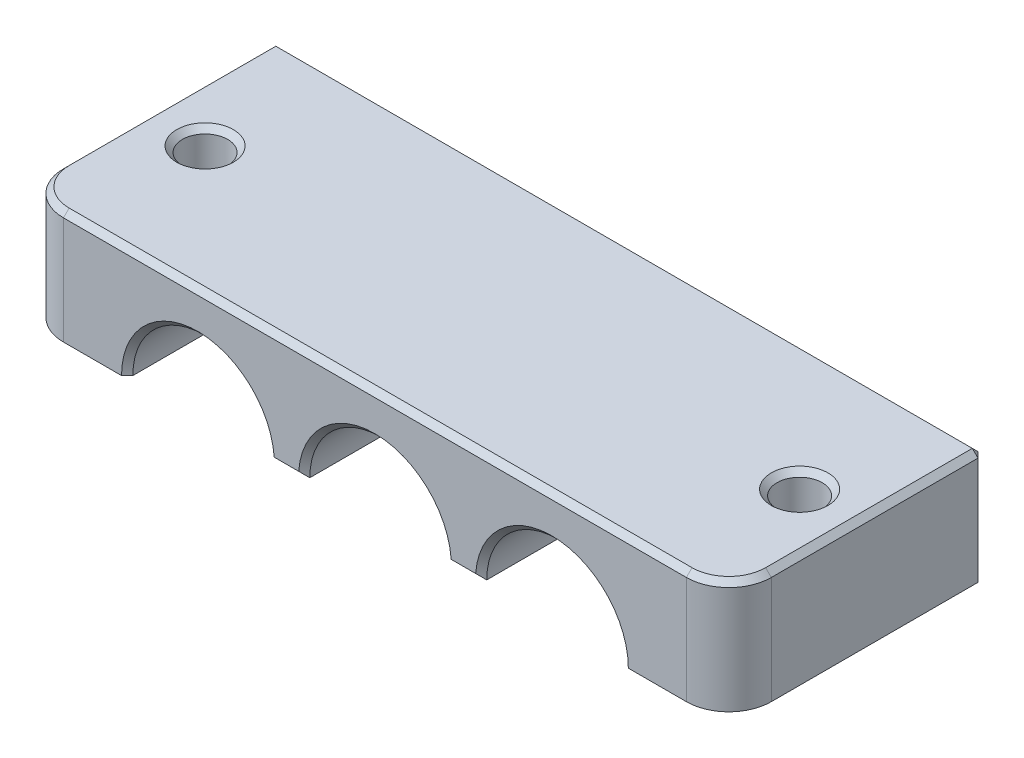
ISO-10303-21;
HEADER;
FILE_DESCRIPTION(('STEP AP214'),'2;1');
FILE_NAME('part.step','',(''),(''),'','','');
FILE_SCHEMA(('AUTOMOTIVE_DESIGN { 1 0 10303 214 1 1 1 1 }'));
ENDSEC;
DATA;
#1=APPLICATION_CONTEXT('core data for automotive mechanical design processes');
#2=APPLICATION_PROTOCOL_DEFINITION('international standard','automotive_design',2000,#1);
#3=PRODUCT_CONTEXT('',#1,'mechanical');
#4=PRODUCT('Part','Part','',(#3));
#5=PRODUCT_RELATED_PRODUCT_CATEGORY('part','',(#4));
#6=PRODUCT_DEFINITION_FORMATION('','',#4);
#7=PRODUCT_DEFINITION_CONTEXT('part definition',#1,'design');
#8=PRODUCT_DEFINITION('design','',#6,#7);
#9=PRODUCT_DEFINITION_SHAPE('','',#8);
#10=(LENGTH_UNIT() NAMED_UNIT(*) SI_UNIT(.MILLI.,.METRE.));
#11=(NAMED_UNIT(*) PLANE_ANGLE_UNIT() SI_UNIT($,.RADIAN.));
#12=(NAMED_UNIT(*) SI_UNIT($,.STERADIAN.) SOLID_ANGLE_UNIT());
#13=UNCERTAINTY_MEASURE_WITH_UNIT(LENGTH_MEASURE(1.E-05),#10,'distance_accuracy_value','');
#14=(GEOMETRIC_REPRESENTATION_CONTEXT(3) GLOBAL_UNCERTAINTY_ASSIGNED_CONTEXT((#13)) GLOBAL_UNIT_ASSIGNED_CONTEXT((#10,
#11,#12)) REPRESENTATION_CONTEXT('',''));
#15=CARTESIAN_POINT('',(0.,0.,0.));
#16=DIRECTION('',(0.,0.,1.));
#17=DIRECTION('',(1.,0.,0.));
#18=AXIS2_PLACEMENT_3D('',#15,#16,#17);
#19=CARTESIAN_POINT('',(0.,0.,18.));
#20=DIRECTION('',(0.,0.,-1.));
#21=DIRECTION('',(-1.,0.,0.));
#22=AXIS2_PLACEMENT_3D('',#19,#20,#21);
#23=CYLINDRICAL_SURFACE('',#22,5.);
#24=DIRECTION('',(0.,0.,-1.));
#25=VECTOR('',#24,1.);
#26=CARTESIAN_POINT('',(-5.,0.,18.));
#27=LINE('',#26,#25);
#28=CARTESIAN_POINT('',(-5.,0.,17.6));
#29=VERTEX_POINT('',#28);
#30=CARTESIAN_POINT('',(-5.,0.,0.400000000000011));
#31=VERTEX_POINT('',#30);
#32=EDGE_CURVE('E576',#29,#31,#27,.T.);
#33=ORIENTED_EDGE('',*,*,#32,.T.);
#34=CARTESIAN_POINT('',(0.,0.,0.400000000000011));
#35=DIRECTION('',(0.,0.,-1.));
#36=DIRECTION('',(-1.,0.,0.));
#37=AXIS2_PLACEMENT_3D('',#34,#35,#36);
#38=CIRCLE('',#37,5.);
#39=CARTESIAN_POINT('',(5.,0.,0.400000000000011));
#40=VERTEX_POINT('',#39);
#41=EDGE_CURVE('E297',#31,#40,#38,.T.);
#42=ORIENTED_EDGE('',*,*,#41,.T.);
#43=DIRECTION('',(0.,0.,-1.));
#44=VECTOR('',#43,1.);
#45=CARTESIAN_POINT('',(5.,0.,18.));
#46=LINE('',#45,#44);
#47=CARTESIAN_POINT('',(5.,0.,17.6));
#48=VERTEX_POINT('',#47);
#49=EDGE_CURVE('E225',#48,#40,#46,.T.);
#50=ORIENTED_EDGE('',*,*,#49,.F.);
#51=CARTESIAN_POINT('',(0.,0.,17.6));
#52=DIRECTION('',(0.,0.,-1.));
#53=DIRECTION('',(-1.,0.,0.));
#54=AXIS2_PLACEMENT_3D('',#51,#52,#53);
#55=CIRCLE('',#54,5.);
#56=EDGE_CURVE('E295',#48,#29,#55,.F.);
#57=ORIENTED_EDGE('',*,*,#56,.T.);
#58=EDGE_LOOP('',(#33,#42,#50,#57));
#59=FACE_BOUND('',#58,.T.);
#60=ADVANCED_FACE('F39',(#59),#23,.F.);
#61=CARTESIAN_POINT('',(5.,0.,18.));
#62=DIRECTION('',(0.,1.,0.));
#63=DIRECTION('',(-1.,0.,0.));
#64=AXIS2_PLACEMENT_3D('',#61,#62,#63);
#65=PLANE('',#64);
#66=ORIENTED_EDGE('',*,*,#49,.T.);
#67=DIRECTION('',(1.,0.,0.));
#68=VECTOR('',#67,1.);
#69=CARTESIAN_POINT('',(7.5,0.,0.400000000000011));
#70=LINE('',#69,#68);
#71=CARTESIAN_POINT('',(7.5,0.,0.400000000000011));
#72=VERTEX_POINT('',#71);
#73=EDGE_CURVE('E293',#40,#72,#70,.T.);
#74=ORIENTED_EDGE('',*,*,#73,.T.);
#75=DIRECTION('',(0.,0.,-1.));
#76=VECTOR('',#75,1.);
#77=CARTESIAN_POINT('',(7.5,0.,18.));
#78=LINE('',#77,#76);
#79=CARTESIAN_POINT('',(7.5,0.,17.6));
#80=VERTEX_POINT('',#79);
#81=EDGE_CURVE('E230',#80,#72,#78,.T.);
#82=ORIENTED_EDGE('',*,*,#81,.F.);
#83=DIRECTION('',(-1.,0.,0.));
#84=VECTOR('',#83,1.);
#85=CARTESIAN_POINT('',(5.,0.,17.6));
#86=LINE('',#85,#84);
#87=EDGE_CURVE('E291',#80,#48,#86,.T.);
#88=ORIENTED_EDGE('',*,*,#87,.T.);
#89=EDGE_LOOP('',(#66,#74,#82,#88));
#90=FACE_BOUND('',#89,.T.);
#91=ADVANCED_FACE('F524',(#90),#65,.F.);
#92=CARTESIAN_POINT('',(12.5,0.,18.));
#93=DIRECTION('',(0.,0.,-1.));
#94=DIRECTION('',(-1.,0.,0.));
#95=AXIS2_PLACEMENT_3D('',#92,#93,#94);
#96=CYLINDRICAL_SURFACE('',#95,5.);
#97=ORIENTED_EDGE('',*,*,#81,.T.);
#98=CARTESIAN_POINT('',(12.5,0.,0.400000000000011));
#99=DIRECTION('',(0.,0.,-1.));
#100=DIRECTION('',(-1.,0.,0.));
#101=AXIS2_PLACEMENT_3D('',#98,#99,#100);
#102=CIRCLE('',#101,5.);
#103=CARTESIAN_POINT('',(17.5,0.,0.400000000000011));
#104=VERTEX_POINT('',#103);
#105=EDGE_CURVE('E265',#72,#104,#102,.T.);
#106=ORIENTED_EDGE('',*,*,#105,.T.);
#107=DIRECTION('',(0.,0.,-1.));
#108=VECTOR('',#107,1.);
#109=CARTESIAN_POINT('',(17.5,0.,18.));
#110=LINE('',#109,#108);
#111=CARTESIAN_POINT('',(17.5,0.,17.6));
#112=VERTEX_POINT('',#111);
#113=EDGE_CURVE('E591',#112,#104,#110,.T.);
#114=ORIENTED_EDGE('',*,*,#113,.F.);
#115=CARTESIAN_POINT('',(12.5,0.,17.6));
#116=DIRECTION('',(0.,0.,-1.));
#117=DIRECTION('',(-1.,0.,0.));
#118=AXIS2_PLACEMENT_3D('',#115,#116,#117);
#119=CIRCLE('',#118,5.);
#120=EDGE_CURVE('E263',#112,#80,#119,.F.);
#121=ORIENTED_EDGE('',*,*,#120,.T.);
#122=EDGE_LOOP('',(#97,#106,#114,#121));
#123=FACE_BOUND('',#122,.T.);
#124=ADVANCED_FACE('F530',(#123),#96,.F.);
#125=CARTESIAN_POINT('',(17.5,0.,18.));
#126=DIRECTION('',(0.,1.,0.));
#127=DIRECTION('',(-1.,0.,0.));
#128=AXIS2_PLACEMENT_3D('',#125,#126,#127);
#129=PLANE('',#128);
#130=CARTESIAN_POINT('',(21.,0.,8.99999999999999));
#131=DIRECTION('',(0.,1.,0.));
#132=DIRECTION('',(0.,0.,1.));
#133=AXIS2_PLACEMENT_3D('',#130,#131,#132);
#134=CIRCLE('',#133,1.6);
#135=CARTESIAN_POINT('',(21.,0.,10.6));
#136=VERTEX_POINT('',#135);
#137=EDGE_CURVE('E388',#136,#136,#134,.T.);
#138=ORIENTED_EDGE('',*,*,#137,.T.);
#139=EDGE_LOOP('',(#138));
#140=FACE_BOUND('',#139,.T.);
#141=ORIENTED_EDGE('',*,*,#113,.T.);
#142=DIRECTION('',(0.707106781186551,0.,-0.707106781186544));
#143=VECTOR('',#142,1.);
#144=CARTESIAN_POINT('',(12.5,0.,5.39999999999997));
#145=LINE('',#144,#143);
#146=CARTESIAN_POINT('',(17.9,0.,0.));
#147=VERTEX_POINT('',#146);
#148=EDGE_CURVE('E272',#104,#147,#145,.T.);
#149=ORIENTED_EDGE('',*,*,#148,.T.);
#150=DIRECTION('',(1.,0.,0.));
#151=VECTOR('',#150,1.);
#152=CARTESIAN_POINT('',(17.5,0.,0.));
#153=LINE('',#152,#151);
#154=CARTESIAN_POINT('',(24.6,0.,0.));
#155=VERTEX_POINT('',#154);
#156=EDGE_CURVE('E568',#147,#155,#153,.T.);
#157=ORIENTED_EDGE('',*,*,#156,.T.);
#158=DIRECTION('',(0.707106781186548,0.,0.707106781186548));
#159=VECTOR('',#158,1.);
#160=CARTESIAN_POINT('',(25.,0.,0.399999999999998));
#161=LINE('',#160,#159);
#162=CARTESIAN_POINT('',(25.,0.,0.399999999999998));
#163=VERTEX_POINT('',#162);
#164=EDGE_CURVE('E270',#155,#163,#161,.T.);
#165=ORIENTED_EDGE('',*,*,#164,.T.);
#166=DIRECTION('',(0.,0.,-1.));
#167=VECTOR('',#166,1.);
#168=CARTESIAN_POINT('',(25.,0.,18.));
#169=LINE('',#168,#167);
#170=CARTESIAN_POINT('',(25.,0.,15.));
#171=VERTEX_POINT('',#170);
#172=EDGE_CURVE('E216',#171,#163,#169,.T.);
#173=ORIENTED_EDGE('',*,*,#172,.F.);
#174=CARTESIAN_POINT('',(22.,0.,15.));
#175=DIRECTION('',(0.,1.,0.));
#176=DIRECTION('',(-1.,0.,0.));
#177=AXIS2_PLACEMENT_3D('',#174,#175,#176);
#178=CIRCLE('',#177,3.);
#179=CARTESIAN_POINT('',(22.,0.,18.));
#180=VERTEX_POINT('',#179);
#181=EDGE_CURVE('E213',#171,#180,#178,.F.);
#182=ORIENTED_EDGE('',*,*,#181,.T.);
#183=DIRECTION('',(1.,0.,0.));
#184=VECTOR('',#183,1.);
#185=CARTESIAN_POINT('',(17.5,0.,18.));
#186=LINE('',#185,#184);
#187=CARTESIAN_POINT('',(17.9,0.,18.));
#188=VERTEX_POINT('',#187);
#189=EDGE_CURVE('E199',#188,#180,#186,.T.);
#190=ORIENTED_EDGE('',*,*,#189,.F.);
#191=DIRECTION('',(-0.707106781186547,0.,-0.707106781186548));
#192=VECTOR('',#191,1.);
#193=CARTESIAN_POINT('',(12.5,0.,12.6));
#194=LINE('',#193,#192);
#195=EDGE_CURVE('E268',#188,#112,#194,.T.);
#196=ORIENTED_EDGE('',*,*,#195,.T.);
#197=EDGE_LOOP('',(#141,#149,#157,#165,#173,#182,#190,#196));
#198=FACE_BOUND('',#197,.T.);
#199=ADVANCED_FACE('F215',(#140,#198),#129,.F.);
#200=CARTESIAN_POINT('',(25.,8.00000000000001,18.));
#201=DIRECTION('',(-1.,0.,0.));
#202=DIRECTION('',(0.,0.,1.));
#203=AXIS2_PLACEMENT_3D('',#200,#201,#202);
#204=PLANE('',#203);
#205=DIRECTION('',(0.,1.,0.));
#206=VECTOR('',#205,1.);
#207=CARTESIAN_POINT('',(25.,8.00000000000001,0.399999999999998));
#208=LINE('',#207,#206);
#209=CARTESIAN_POINT('',(25.,7.60000000000001,0.399999999999998));
#210=VERTEX_POINT('',#209);
#211=EDGE_CURVE('E54',#163,#210,#208,.T.);
#212=ORIENTED_EDGE('',*,*,#211,.T.);
#213=DIRECTION('',(0.,0.,1.));
#214=VECTOR('',#213,1.);
#215=CARTESIAN_POINT('',(25.,7.60000000000001,18.));
#216=LINE('',#215,#214);
#217=CARTESIAN_POINT('',(25.,7.60000000000001,15.));
#218=VERTEX_POINT('',#217);
#219=EDGE_CURVE('E11',#210,#218,#216,.T.);
#220=ORIENTED_EDGE('',*,*,#219,.T.);
#221=DIRECTION('',(0.,1.,0.));
#222=VECTOR('',#221,1.);
#223=CARTESIAN_POINT('',(25.,8.00000000000001,15.));
#224=LINE('',#223,#222);
#225=EDGE_CURVE('E219',#218,#171,#224,.F.);
#226=ORIENTED_EDGE('',*,*,#225,.T.);
#227=ORIENTED_EDGE('',*,*,#172,.T.);
#228=EDGE_LOOP('',(#212,#220,#226,#227));
#229=FACE_BOUND('',#228,.T.);
#230=ADVANCED_FACE('F614',(#229),#204,.F.);
#231=CARTESIAN_POINT('',(-25.,8.,18.));
#232=DIRECTION('',(0.,-1.,0.));
#233=DIRECTION('',(1.,0.,0.));
#234=AXIS2_PLACEMENT_3D('',#231,#232,#233);
#235=PLANE('',#234);
#236=CARTESIAN_POINT('',(21.,8.00000000000001,8.99999999999999));
#237=DIRECTION('',(0.,-1.,0.));
#238=DIRECTION('',(1.,0.,0.));
#239=AXIS2_PLACEMENT_3D('',#236,#237,#238);
#240=CIRCLE('',#239,2.00000000000002);
#241=CARTESIAN_POINT('',(23.,8.00000000000001,8.99999999999999));
#242=VERTEX_POINT('',#241);
#243=EDGE_CURVE('E257',#242,#242,#240,.T.);
#244=ORIENTED_EDGE('',*,*,#243,.T.);
#245=EDGE_LOOP('',(#244));
#246=FACE_BOUND('',#245,.T.);
#247=CARTESIAN_POINT('',(-21.,8.,9.));
#248=DIRECTION('',(0.,-1.,0.));
#249=DIRECTION('',(1.,0.,0.));
#250=AXIS2_PLACEMENT_3D('',#247,#248,#249);
#251=CIRCLE('',#250,2.00000000000002);
#252=CARTESIAN_POINT('',(-19.,8.,9.));
#253=VERTEX_POINT('',#252);
#254=EDGE_CURVE('E254',#253,#253,#251,.T.);
#255=ORIENTED_EDGE('',*,*,#254,.T.);
#256=EDGE_LOOP('',(#255));
#257=FACE_BOUND('',#256,.T.);
#258=DIRECTION('',(0.,0.,-1.));
#259=VECTOR('',#258,1.);
#260=CARTESIAN_POINT('',(24.6,8.00000000000001,18.));
#261=LINE('',#260,#259);
#262=CARTESIAN_POINT('',(24.6,8.00000000000001,15.));
#263=VERTEX_POINT('',#262);
#264=CARTESIAN_POINT('',(24.6,8.00000000000001,0.399999999999998));
#265=VERTEX_POINT('',#264);
#266=EDGE_CURVE('E241',#263,#265,#261,.T.);
#267=ORIENTED_EDGE('',*,*,#266,.T.);
#268=DIRECTION('',(-1.,0.,0.));
#269=VECTOR('',#268,1.);
#270=CARTESIAN_POINT('',(-25.,8.,0.399999999999998));
#271=LINE('',#270,#269);
#272=CARTESIAN_POINT('',(-24.6,8.,0.399999999999998));
#273=VERTEX_POINT('',#272);
#274=EDGE_CURVE('E251',#265,#273,#271,.T.);
#275=ORIENTED_EDGE('',*,*,#274,.T.);
#276=DIRECTION('',(0.,0.,1.));
#277=VECTOR('',#276,1.);
#278=CARTESIAN_POINT('',(-24.6,8.,18.));
#279=LINE('',#278,#277);
#280=CARTESIAN_POINT('',(-24.6,8.,15.));
#281=VERTEX_POINT('',#280);
#282=EDGE_CURVE('E249',#273,#281,#279,.T.);
#283=ORIENTED_EDGE('',*,*,#282,.T.);
#284=CARTESIAN_POINT('',(-22.,8.,15.));
#285=DIRECTION('',(0.,-1.,0.));
#286=DIRECTION('',(1.,0.,0.));
#287=AXIS2_PLACEMENT_3D('',#284,#285,#286);
#288=CIRCLE('',#287,2.6);
#289=CARTESIAN_POINT('',(-22.,8.,17.6));
#290=VERTEX_POINT('',#289);
#291=EDGE_CURVE('E247',#281,#290,#288,.F.);
#292=ORIENTED_EDGE('',*,*,#291,.T.);
#293=DIRECTION('',(1.,0.,0.));
#294=VECTOR('',#293,1.);
#295=CARTESIAN_POINT('',(-25.,8.,17.6));
#296=LINE('',#295,#294);
#297=CARTESIAN_POINT('',(22.,8.00000000000001,17.6));
#298=VERTEX_POINT('',#297);
#299=EDGE_CURVE('E245',#290,#298,#296,.T.);
#300=ORIENTED_EDGE('',*,*,#299,.T.);
#301=CARTESIAN_POINT('',(22.,8.00000000000001,15.));
#302=DIRECTION('',(0.,-1.,0.));
#303=DIRECTION('',(1.,0.,0.));
#304=AXIS2_PLACEMENT_3D('',#301,#302,#303);
#305=CIRCLE('',#304,2.6);
#306=EDGE_CURVE('E243',#298,#263,#305,.F.);
#307=ORIENTED_EDGE('',*,*,#306,.T.);
#308=EDGE_LOOP('',(#267,#275,#283,#292,#300,#307));
#309=FACE_BOUND('',#308,.T.);
#310=ADVANCED_FACE('F683',(#246,#257,#309),#235,.F.);
#311=CARTESIAN_POINT('',(-25.,8.,18.));
#312=DIRECTION('',(1.,0.,0.));
#313=DIRECTION('',(0.,0.,-1.));
#314=AXIS2_PLACEMENT_3D('',#311,#312,#313);
#315=PLANE('',#314);
#316=DIRECTION('',(0.,0.,-1.));
#317=VECTOR('',#316,1.);
#318=CARTESIAN_POINT('',(-25.,7.6,18.));
#319=LINE('',#318,#317);
#320=CARTESIAN_POINT('',(-25.,7.6,15.));
#321=VERTEX_POINT('',#320);
#322=CARTESIAN_POINT('',(-25.,7.6,0.399999999999998));
#323=VERTEX_POINT('',#322);
#324=EDGE_CURVE('E313',#321,#323,#319,.T.);
#325=ORIENTED_EDGE('',*,*,#324,.T.);
#326=DIRECTION('',(0.,-1.,0.));
#327=VECTOR('',#326,1.);
#328=CARTESIAN_POINT('',(-25.,0.,0.399999999999998));
#329=LINE('',#328,#327);
#330=CARTESIAN_POINT('',(-25.,0.,0.399999999999998));
#331=VERTEX_POINT('',#330);
#332=EDGE_CURVE('E315',#323,#331,#329,.T.);
#333=ORIENTED_EDGE('',*,*,#332,.T.);
#334=DIRECTION('',(0.,0.,-1.));
#335=VECTOR('',#334,1.);
#336=CARTESIAN_POINT('',(-25.,0.,18.));
#337=LINE('',#336,#335);
#338=CARTESIAN_POINT('',(-25.,0.,15.));
#339=VERTEX_POINT('',#338);
#340=EDGE_CURVE('E587',#339,#331,#337,.T.);
#341=ORIENTED_EDGE('',*,*,#340,.F.);
#342=DIRECTION('',(0.,-1.,0.));
#343=VECTOR('',#342,1.);
#344=CARTESIAN_POINT('',(-25.,8.,15.));
#345=LINE('',#344,#343);
#346=EDGE_CURVE('E235',#339,#321,#345,.F.);
#347=ORIENTED_EDGE('',*,*,#346,.T.);
#348=EDGE_LOOP('',(#325,#333,#341,#347));
#349=FACE_BOUND('',#348,.T.);
#350=ADVANCED_FACE('F673',(#349),#315,.F.);
#351=CARTESIAN_POINT('',(-25.,0.,18.));
#352=DIRECTION('',(0.,1.,0.));
#353=DIRECTION('',(-1.,0.,0.));
#354=AXIS2_PLACEMENT_3D('',#351,#352,#353);
#355=PLANE('',#354);
#356=CARTESIAN_POINT('',(-21.,0.,9.));
#357=DIRECTION('',(0.,1.,0.));
#358=DIRECTION('',(0.,0.,1.));
#359=AXIS2_PLACEMENT_3D('',#356,#357,#358);
#360=CIRCLE('',#359,1.6);
#361=CARTESIAN_POINT('',(-21.,0.,10.6));
#362=VERTEX_POINT('',#361);
#363=EDGE_CURVE('E566',#362,#362,#360,.T.);
#364=ORIENTED_EDGE('',*,*,#363,.T.);
#365=EDGE_LOOP('',(#364));
#366=FACE_BOUND('',#365,.T.);
#367=DIRECTION('',(1.,0.,0.));
#368=VECTOR('',#367,1.);
#369=CARTESIAN_POINT('',(-25.,0.,0.));
#370=LINE('',#369,#368);
#371=CARTESIAN_POINT('',(-24.6,0.,0.));
#372=VERTEX_POINT('',#371);
#373=CARTESIAN_POINT('',(-17.9,0.,0.));
#374=VERTEX_POINT('',#373);
#375=EDGE_CURVE('E209',#372,#374,#370,.T.);
#376=ORIENTED_EDGE('',*,*,#375,.T.);
#377=DIRECTION('',(0.707106781186551,0.,0.707106781186544));
#378=VECTOR('',#377,1.);
#379=CARTESIAN_POINT('',(-12.5,0.,5.39999999999997));
#380=LINE('',#379,#378);
#381=CARTESIAN_POINT('',(-17.5,0.,0.400000000000011));
#382=VERTEX_POINT('',#381);
#383=EDGE_CURVE('E311',#374,#382,#380,.T.);
#384=ORIENTED_EDGE('',*,*,#383,.T.);
#385=DIRECTION('',(0.,0.,-1.));
#386=VECTOR('',#385,1.);
#387=CARTESIAN_POINT('',(-17.5,0.,18.));
#388=LINE('',#387,#386);
#389=CARTESIAN_POINT('',(-17.5,0.,17.6));
#390=VERTEX_POINT('',#389);
#391=EDGE_CURVE('E584',#390,#382,#388,.T.);
#392=ORIENTED_EDGE('',*,*,#391,.F.);
#393=DIRECTION('',(-0.707106781186547,0.,0.707106781186548));
#394=VECTOR('',#393,1.);
#395=CARTESIAN_POINT('',(-12.5,0.,12.6));
#396=LINE('',#395,#394);
#397=CARTESIAN_POINT('',(-17.9,0.,18.));
#398=VERTEX_POINT('',#397);
#399=EDGE_CURVE('E307',#390,#398,#396,.T.);
#400=ORIENTED_EDGE('',*,*,#399,.T.);
#401=DIRECTION('',(1.,0.,0.));
#402=VECTOR('',#401,1.);
#403=CARTESIAN_POINT('',(-25.,0.,18.));
#404=LINE('',#403,#402);
#405=CARTESIAN_POINT('',(-22.,0.,18.));
#406=VERTEX_POINT('',#405);
#407=EDGE_CURVE('E208',#406,#398,#404,.T.);
#408=ORIENTED_EDGE('',*,*,#407,.F.);
#409=CARTESIAN_POINT('',(-22.,0.,15.));
#410=DIRECTION('',(0.,1.,0.));
#411=DIRECTION('',(-1.,0.,0.));
#412=AXIS2_PLACEMENT_3D('',#409,#410,#411);
#413=CIRCLE('',#412,3.);
#414=EDGE_CURVE('E227',#406,#339,#413,.F.);
#415=ORIENTED_EDGE('',*,*,#414,.T.);
#416=ORIENTED_EDGE('',*,*,#340,.T.);
#417=DIRECTION('',(0.707106781186548,0.,-0.707106781186548));
#418=VECTOR('',#417,1.);
#419=CARTESIAN_POINT('',(-25.,0.,0.399999999999998));
#420=LINE('',#419,#418);
#421=EDGE_CURVE('E309',#331,#372,#420,.T.);
#422=ORIENTED_EDGE('',*,*,#421,.T.);
#423=EDGE_LOOP('',(#376,#384,#392,#400,#408,#415,#416,#422));
#424=FACE_BOUND('',#423,.T.);
#425=ADVANCED_FACE('F665',(#366,#424),#355,.F.);
#426=CARTESIAN_POINT('',(-12.5,0.,18.));
#427=DIRECTION('',(0.,0.,-1.));
#428=DIRECTION('',(-1.,0.,0.));
#429=AXIS2_PLACEMENT_3D('',#426,#427,#428);
#430=CYLINDRICAL_SURFACE('',#429,5.);
#431=ORIENTED_EDGE('',*,*,#391,.T.);
#432=CARTESIAN_POINT('',(-12.5,0.,0.400000000000011));
#433=DIRECTION('',(0.,0.,-1.));
#434=DIRECTION('',(-1.,0.,0.));
#435=AXIS2_PLACEMENT_3D('',#432,#433,#434);
#436=CIRCLE('',#435,5.);
#437=CARTESIAN_POINT('',(-7.5,0.,0.400000000000011));
#438=VERTEX_POINT('',#437);
#439=EDGE_CURVE('E305',#382,#438,#436,.T.);
#440=ORIENTED_EDGE('',*,*,#439,.T.);
#441=DIRECTION('',(0.,0.,-1.));
#442=VECTOR('',#441,1.);
#443=CARTESIAN_POINT('',(-7.5,0.,18.));
#444=LINE('',#443,#442);
#445=CARTESIAN_POINT('',(-7.5,0.,17.6));
#446=VERTEX_POINT('',#445);
#447=EDGE_CURVE('E581',#446,#438,#444,.T.);
#448=ORIENTED_EDGE('',*,*,#447,.F.);
#449=CARTESIAN_POINT('',(-12.5,0.,17.6));
#450=DIRECTION('',(0.,0.,-1.));
#451=DIRECTION('',(-1.,0.,0.));
#452=AXIS2_PLACEMENT_3D('',#449,#450,#451);
#453=CIRCLE('',#452,5.);
#454=EDGE_CURVE('E303',#446,#390,#453,.F.);
#455=ORIENTED_EDGE('',*,*,#454,.T.);
#456=EDGE_LOOP('',(#431,#440,#448,#455));
#457=FACE_BOUND('',#456,.T.);
#458=ADVANCED_FACE('F658',(#457),#430,.F.);
#459=CARTESIAN_POINT('',(-7.5,0.,18.));
#460=DIRECTION('',(0.,1.,0.));
#461=DIRECTION('',(-1.,0.,0.));
#462=AXIS2_PLACEMENT_3D('',#459,#460,#461);
#463=PLANE('',#462);
#464=ORIENTED_EDGE('',*,*,#447,.T.);
#465=DIRECTION('',(1.,0.,0.));
#466=VECTOR('',#465,1.);
#467=CARTESIAN_POINT('',(-5.,0.,0.400000000000011));
#468=LINE('',#467,#466);
#469=EDGE_CURVE('E301',#438,#31,#468,.T.);
#470=ORIENTED_EDGE('',*,*,#469,.T.);
#471=ORIENTED_EDGE('',*,*,#32,.F.);
#472=DIRECTION('',(-1.,0.,0.));
#473=VECTOR('',#472,1.);
#474=CARTESIAN_POINT('',(-7.5,0.,17.6));
#475=LINE('',#474,#473);
#476=EDGE_CURVE('E299',#29,#446,#475,.T.);
#477=ORIENTED_EDGE('',*,*,#476,.T.);
#478=EDGE_LOOP('',(#464,#470,#471,#477));
#479=FACE_BOUND('',#478,.T.);
#480=ADVANCED_FACE('F654',(#479),#463,.F.);
#481=CARTESIAN_POINT('',(0.,0.,18.));
#482=DIRECTION('',(0.,0.,-1.));
#483=DIRECTION('',(-1.,0.,0.));
#484=AXIS2_PLACEMENT_3D('',#481,#482,#483);
#485=PLANE('',#484);
#486=DIRECTION('',(0.,1.,0.));
#487=VECTOR('',#486,1.);
#488=CARTESIAN_POINT('',(22.,0.,18.));
#489=LINE('',#488,#487);
#490=CARTESIAN_POINT('',(22.,7.60000000000001,18.));
#491=VERTEX_POINT('',#490);
#492=EDGE_CURVE('E203',#180,#491,#489,.T.);
#493=ORIENTED_EDGE('',*,*,#492,.T.);
#494=DIRECTION('',(-1.,0.,0.));
#495=VECTOR('',#494,1.);
#496=CARTESIAN_POINT('',(0.,7.60000000000001,18.));
#497=LINE('',#496,#495);
#498=CARTESIAN_POINT('',(-22.,7.6,18.));
#499=VERTEX_POINT('',#498);
#500=EDGE_CURVE('E328',#491,#499,#497,.T.);
#501=ORIENTED_EDGE('',*,*,#500,.T.);
#502=DIRECTION('',(0.,-1.,0.));
#503=VECTOR('',#502,1.);
#504=CARTESIAN_POINT('',(-22.,0.,18.));
#505=LINE('',#504,#503);
#506=EDGE_CURVE('E224',#499,#406,#505,.T.);
#507=ORIENTED_EDGE('',*,*,#506,.T.);
#508=ORIENTED_EDGE('',*,*,#407,.T.);
#509=CARTESIAN_POINT('',(-12.5,0.,18.));
#510=DIRECTION('',(0.,0.,-1.));
#511=DIRECTION('',(-1.,0.,0.));
#512=AXIS2_PLACEMENT_3D('',#509,#510,#511);
#513=CIRCLE('',#512,5.40000000000001);
#514=CARTESIAN_POINT('',(-7.11483519286549,0.400000000000008,18.));
#515=VERTEX_POINT('',#514);
#516=EDGE_CURVE('E319',#398,#515,#513,.T.);
#517=ORIENTED_EDGE('',*,*,#516,.T.);
#518=DIRECTION('',(1.,0.,0.));
#519=VECTOR('',#518,1.);
#520=CARTESIAN_POINT('',(0.,0.400000000000008,18.));
#521=LINE('',#520,#519);
#522=CARTESIAN_POINT('',(-5.38516480713451,0.400000000000008,18.));
#523=VERTEX_POINT('',#522);
#524=EDGE_CURVE('E321',#515,#523,#521,.T.);
#525=ORIENTED_EDGE('',*,*,#524,.T.);
#526=CARTESIAN_POINT('',(0.,0.,18.));
#527=DIRECTION('',(0.,0.,-1.));
#528=DIRECTION('',(-1.,0.,0.));
#529=AXIS2_PLACEMENT_3D('',#526,#527,#528);
#530=CIRCLE('',#529,5.40000000000001);
#531=CARTESIAN_POINT('',(5.38516480713451,0.400000000000008,18.));
#532=VERTEX_POINT('',#531);
#533=EDGE_CURVE('E323',#523,#532,#530,.T.);
#534=ORIENTED_EDGE('',*,*,#533,.T.);
#535=DIRECTION('',(1.,0.,0.));
#536=VECTOR('',#535,1.);
#537=CARTESIAN_POINT('',(0.,0.400000000000008,18.));
#538=LINE('',#537,#536);
#539=CARTESIAN_POINT('',(7.11483519286549,0.400000000000008,18.));
#540=VERTEX_POINT('',#539);
#541=EDGE_CURVE('E325',#532,#540,#538,.T.);
#542=ORIENTED_EDGE('',*,*,#541,.T.);
#543=CARTESIAN_POINT('',(12.5,0.,18.));
#544=DIRECTION('',(0.,0.,-1.));
#545=DIRECTION('',(-1.,0.,0.));
#546=AXIS2_PLACEMENT_3D('',#543,#544,#545);
#547=CIRCLE('',#546,5.40000000000001);
#548=EDGE_CURVE('E206',#540,#188,#547,.T.);
#549=ORIENTED_EDGE('',*,*,#548,.T.);
#550=ORIENTED_EDGE('',*,*,#189,.T.);
#551=EDGE_LOOP('',(#493,#501,#507,#508,#517,#525,#534,#542,#549,#550));
#552=FACE_BOUND('',#551,.T.);
#553=ADVANCED_FACE('F201',(#552),#485,.F.);
#554=CARTESIAN_POINT('',(0.,0.,0.));
#555=DIRECTION('',(0.,0.,-1.));
#556=DIRECTION('',(-1.,0.,0.));
#557=AXIS2_PLACEMENT_3D('',#554,#555,#556);
#558=PLANE('',#557);
#559=ORIENTED_EDGE('',*,*,#156,.F.);
#560=CARTESIAN_POINT('',(12.5,0.,0.));
#561=DIRECTION('',(0.,0.,-1.));
#562=DIRECTION('',(-1.,0.,0.));
#563=AXIS2_PLACEMENT_3D('',#560,#561,#562);
#564=CIRCLE('',#563,5.40000000000002);
#565=CARTESIAN_POINT('',(7.11483519286548,0.400000000000015,0.));
#566=VERTEX_POINT('',#565);
#567=EDGE_CURVE('E289',#147,#566,#564,.F.);
#568=ORIENTED_EDGE('',*,*,#567,.T.);
#569=DIRECTION('',(-1.,0.,0.));
#570=VECTOR('',#569,1.);
#571=CARTESIAN_POINT('',(5.,0.400000000000015,0.));
#572=LINE('',#571,#570);
#573=CARTESIAN_POINT('',(5.38516480713452,0.400000000000015,0.));
#574=VERTEX_POINT('',#573);
#575=EDGE_CURVE('E287',#566,#574,#572,.T.);
#576=ORIENTED_EDGE('',*,*,#575,.T.);
#577=CARTESIAN_POINT('',(0.,0.,0.));
#578=DIRECTION('',(0.,0.,-1.));
#579=DIRECTION('',(-1.,0.,0.));
#580=AXIS2_PLACEMENT_3D('',#577,#578,#579);
#581=CIRCLE('',#580,5.40000000000001);
#582=CARTESIAN_POINT('',(-5.38516480713452,0.400000000000015,0.));
#583=VERTEX_POINT('',#582);
#584=EDGE_CURVE('E285',#574,#583,#581,.F.);
#585=ORIENTED_EDGE('',*,*,#584,.T.);
#586=DIRECTION('',(-1.,0.,0.));
#587=VECTOR('',#586,1.);
#588=CARTESIAN_POINT('',(-7.5,0.400000000000015,0.));
#589=LINE('',#588,#587);
#590=CARTESIAN_POINT('',(-7.11483519286548,0.400000000000015,0.));
#591=VERTEX_POINT('',#590);
#592=EDGE_CURVE('E283',#583,#591,#589,.T.);
#593=ORIENTED_EDGE('',*,*,#592,.T.);
#594=CARTESIAN_POINT('',(-12.5,0.,0.));
#595=DIRECTION('',(0.,0.,-1.));
#596=DIRECTION('',(-1.,0.,0.));
#597=AXIS2_PLACEMENT_3D('',#594,#595,#596);
#598=CIRCLE('',#597,5.40000000000002);
#599=EDGE_CURVE('E281',#591,#374,#598,.F.);
#600=ORIENTED_EDGE('',*,*,#599,.T.);
#601=ORIENTED_EDGE('',*,*,#375,.F.);
#602=DIRECTION('',(0.,1.,0.));
#603=VECTOR('',#602,1.);
#604=CARTESIAN_POINT('',(-24.6,8.,0.));
#605=LINE('',#604,#603);
#606=CARTESIAN_POINT('',(-24.6,7.6,0.));
#607=VERTEX_POINT('',#606);
#608=EDGE_CURVE('E279',#372,#607,#605,.T.);
#609=ORIENTED_EDGE('',*,*,#608,.T.);
#610=DIRECTION('',(1.,0.,0.));
#611=VECTOR('',#610,1.);
#612=CARTESIAN_POINT('',(25.,7.60000000000001,0.));
#613=LINE('',#612,#611);
#614=CARTESIAN_POINT('',(24.6,7.60000000000001,0.));
#615=VERTEX_POINT('',#614);
#616=EDGE_CURVE('E276',#607,#615,#613,.T.);
#617=ORIENTED_EDGE('',*,*,#616,.T.);
#618=DIRECTION('',(0.,-1.,0.));
#619=VECTOR('',#618,1.);
#620=CARTESIAN_POINT('',(24.6,0.,0.));
#621=LINE('',#620,#619);
#622=EDGE_CURVE('E274',#615,#155,#621,.T.);
#623=ORIENTED_EDGE('',*,*,#622,.T.);
#624=EDGE_LOOP('',(#559,#568,#576,#585,#593,#600,#601,#609,#617,#623));
#625=FACE_BOUND('',#624,.T.);
#626=ADVANCED_FACE('F562',(#625),#558,.T.);
#627=CARTESIAN_POINT('',(-21.,0.,9.));
#628=DIRECTION('',(0.,1.,0.));
#629=DIRECTION('',(0.,0.,1.));
#630=AXIS2_PLACEMENT_3D('',#627,#628,#629);
#631=CYLINDRICAL_SURFACE('',#630,1.6);
#632=CARTESIAN_POINT('',(-21.,7.59999999999999,9.));
#633=DIRECTION('',(0.,-1.,0.));
#634=DIRECTION('',(0.,0.,-1.));
#635=AXIS2_PLACEMENT_3D('',#632,#633,#634);
#636=CIRCLE('',#635,1.6);
#637=CARTESIAN_POINT('',(-21.,7.59999999999999,7.4));
#638=VERTEX_POINT('',#637);
#639=EDGE_CURVE('E260',#638,#638,#636,.F.);
#640=ORIENTED_EDGE('',*,*,#639,.T.);
#641=EDGE_LOOP('',(#640));
#642=FACE_BOUND('',#641,.T.);
#643=ORIENTED_EDGE('',*,*,#363,.F.);
#644=EDGE_LOOP('',(#643));
#645=FACE_BOUND('',#644,.T.);
#646=ADVANCED_FACE('F559',(#642,#645),#631,.F.);
#647=CARTESIAN_POINT('',(21.,0.,8.99999999999999));
#648=DIRECTION('',(0.,1.,0.));
#649=DIRECTION('',(0.,0.,1.));
#650=AXIS2_PLACEMENT_3D('',#647,#648,#649);
#651=CYLINDRICAL_SURFACE('',#650,1.6);
#652=CARTESIAN_POINT('',(21.,7.6,8.99999999999999));
#653=DIRECTION('',(0.,-1.,0.));
#654=DIRECTION('',(0.,0.,-1.));
#655=AXIS2_PLACEMENT_3D('',#652,#653,#654);
#656=CIRCLE('',#655,1.6);
#657=CARTESIAN_POINT('',(21.,7.6,7.39999999999999));
#658=VERTEX_POINT('',#657);
#659=EDGE_CURVE('E218',#658,#658,#656,.F.);
#660=ORIENTED_EDGE('',*,*,#659,.T.);
#661=EDGE_LOOP('',(#660));
#662=FACE_BOUND('',#661,.T.);
#663=ORIENTED_EDGE('',*,*,#137,.F.);
#664=EDGE_LOOP('',(#663));
#665=FACE_BOUND('',#664,.T.);
#666=ADVANCED_FACE('F539',(#662,#665),#651,.F.);
#667=CARTESIAN_POINT('',(-22.,0.,15.));
#668=DIRECTION('',(0.,-1.,0.));
#669=DIRECTION('',(0.,0.,-1.));
#670=AXIS2_PLACEMENT_3D('',#667,#668,#669);
#671=CYLINDRICAL_SURFACE('',#670,3.);
#672=ORIENTED_EDGE('',*,*,#506,.F.);
#673=CARTESIAN_POINT('',(-22.,7.6,15.));
#674=DIRECTION('',(0.,-1.,0.));
#675=DIRECTION('',(0.,0.,-1.));
#676=AXIS2_PLACEMENT_3D('',#673,#674,#675);
#677=CIRCLE('',#676,3.);
#678=EDGE_CURVE('E317',#499,#321,#677,.T.);
#679=ORIENTED_EDGE('',*,*,#678,.T.);
#680=ORIENTED_EDGE('',*,*,#346,.F.);
#681=ORIENTED_EDGE('',*,*,#414,.F.);
#682=EDGE_LOOP('',(#672,#679,#680,#681));
#683=FACE_BOUND('',#682,.T.);
#684=ADVANCED_FACE('F536',(#683),#671,.T.);
#685=CARTESIAN_POINT('',(22.,0.,15.));
#686=DIRECTION('',(0.,1.,0.));
#687=DIRECTION('',(0.,0.,1.));
#688=AXIS2_PLACEMENT_3D('',#685,#686,#687);
#689=CYLINDRICAL_SURFACE('',#688,3.);
#690=ORIENTED_EDGE('',*,*,#225,.F.);
#691=CARTESIAN_POINT('',(22.,7.60000000000001,15.));
#692=DIRECTION('',(0.,-1.,0.));
#693=DIRECTION('',(0.,0.,-1.));
#694=AXIS2_PLACEMENT_3D('',#691,#692,#693);
#695=CIRCLE('',#694,3.);
#696=EDGE_CURVE('E223',#218,#491,#695,.T.);
#697=ORIENTED_EDGE('',*,*,#696,.T.);
#698=ORIENTED_EDGE('',*,*,#492,.F.);
#699=ORIENTED_EDGE('',*,*,#181,.F.);
#700=EDGE_LOOP('',(#690,#697,#698,#699));
#701=FACE_BOUND('',#700,.T.);
#702=ADVANCED_FACE('F221',(#701),#689,.T.);
#703=CARTESIAN_POINT('',(21.,7.6,8.99999999999999));
#704=DIRECTION('',(0.,1.,0.));
#705=DIRECTION('',(0.,0.,1.));
#706=AXIS2_PLACEMENT_3D('',#703,#704,#705);
#707=CONICAL_SURFACE('',#706,1.6,0.785398163397454);
#708=ORIENTED_EDGE('',*,*,#243,.F.);
#709=EDGE_LOOP('',(#708));
#710=FACE_BOUND('',#709,.T.);
#711=ORIENTED_EDGE('',*,*,#659,.F.);
#712=EDGE_LOOP('',(#711));
#713=FACE_BOUND('',#712,.T.);
#714=ADVANCED_FACE('F543',(#710,#713),#707,.F.);
#715=CARTESIAN_POINT('',(-21.,7.59999999999999,9.));
#716=DIRECTION('',(0.,1.,0.));
#717=DIRECTION('',(0.,0.,1.));
#718=AXIS2_PLACEMENT_3D('',#715,#716,#717);
#719=CONICAL_SURFACE('',#718,1.6,0.785398163397457);
#720=ORIENTED_EDGE('',*,*,#254,.F.);
#721=EDGE_LOOP('',(#720));
#722=FACE_BOUND('',#721,.T.);
#723=ORIENTED_EDGE('',*,*,#639,.F.);
#724=EDGE_LOOP('',(#723));
#725=FACE_BOUND('',#724,.T.);
#726=ADVANCED_FACE('F399',(#722,#725),#719,.F.);
#727=CARTESIAN_POINT('',(-12.5,0.,0.400000000000011));
#728=DIRECTION('',(0.,0.,-1.));
#729=DIRECTION('',(-1.,0.,0.));
#730=AXIS2_PLACEMENT_3D('',#727,#728,#729);
#731=CONICAL_SURFACE('',#730,5.,0.785398163397453);
#732=ORIENTED_EDGE('',*,*,#383,.F.);
#733=ORIENTED_EDGE('',*,*,#599,.F.);
#734=CARTESIAN_POINT('',(-7.11483519286548,0.400000000000015,0.));
#735=CARTESIAN_POINT('',(-7.14613726702183,0.366286837951599,0.0337131620484157));
#736=CARTESIAN_POINT('',(-7.1776298756931,0.332662002237035,0.067337997762979));
#737=CARTESIAN_POINT('',(-7.24100643035587,0.265600878920304,0.13439912107971));
#738=CARTESIAN_POINT('',(-7.27289034705552,0.232164577475342,0.167835422524671));
#739=CARTESIAN_POINT('',(-7.33706466946768,0.165487160458206,0.234512839541807));
#740=CARTESIAN_POINT('',(-7.36935507808071,0.132246046281283,0.267753953718729));
#741=CARTESIAN_POINT('',(-7.43435808120664,0.065967220598776,0.334032779401236));
#742=CARTESIAN_POINT('',(-7.46707070695745,0.0329295244133561,0.367070475586656));
#743=CARTESIAN_POINT('',(-7.49999999999997,0.,0.400000000000024));
#744=B_SPLINE_CURVE_WITH_KNOTS('',3,(#734,#735,#736,#737,#738,#739,#740,#741,#742,#743),
.UNSPECIFIED.,.F.,.F.,(4,2,2,2,4),(0.,0.171104320294559,0.342195909551042,0.513288720330671,
0.684394262882535),.UNSPECIFIED.);
#745=EDGE_CURVE('E381',#438,#591,#744,.F.);
#746=ORIENTED_EDGE('',*,*,#745,.F.);
#747=ORIENTED_EDGE('',*,*,#439,.F.);
#748=EDGE_LOOP('',(#732,#733,#746,#747));
#749=FACE_BOUND('',#748,.T.);
#750=ADVANCED_FACE('F392',(#749),#731,.F.);
#751=CARTESIAN_POINT('',(-7.5,0.,0.400000000000011));
#752=DIRECTION('',(0.,-0.707106781186544,-0.707106781186551));
#753=DIRECTION('',(-1.,0.,0.));
#754=AXIS2_PLACEMENT_3D('',#751,#752,#753);
#755=PLANE('',#754);
#756=ORIENTED_EDGE('',*,*,#745,.T.);
#757=ORIENTED_EDGE('',*,*,#592,.F.);
#758=CARTESIAN_POINT('',(-5.38516480713452,0.400000000000015,0.));
#759=CARTESIAN_POINT('',(-5.35386273297817,0.366286837951599,0.0337131620484158));
#760=CARTESIAN_POINT('',(-5.3223701243069,0.332662002237035,0.0673379977629791));
#761=CARTESIAN_POINT('',(-5.25899356964413,0.265600878920304,0.13439912107971));
#762=CARTESIAN_POINT('',(-5.22710965294447,0.232164577475342,0.167835422524671));
#763=CARTESIAN_POINT('',(-5.16293533053232,0.165487160458206,0.234512839541806));
#764=CARTESIAN_POINT('',(-5.13064492191929,0.132246046281284,0.267753953718729));
#765=CARTESIAN_POINT('',(-5.06564191879335,0.0659672205987765,0.334032779401235));
#766=CARTESIAN_POINT('',(-5.03292929304255,0.0329295244133566,0.367070475586655));
#767=CARTESIAN_POINT('',(-5.00000000000002,0.,0.400000000000024));
#768=B_SPLINE_CURVE_WITH_KNOTS('',3,(#758,#759,#760,#761,#762,#763,#764,#765,#766,#767),
.UNSPECIFIED.,.F.,.F.,(4,2,2,2,4),(0.,0.171104320294558,0.342195909551042,0.513288720330669,
0.684394262882534),.UNSPECIFIED.);
#769=EDGE_CURVE('E374',#31,#583,#768,.F.);
#770=ORIENTED_EDGE('',*,*,#769,.F.);
#771=ORIENTED_EDGE('',*,*,#469,.F.);
#772=EDGE_LOOP('',(#756,#757,#770,#771));
#773=FACE_BOUND('',#772,.T.);
#774=ADVANCED_FACE('F369',(#773),#755,.T.);
#775=CARTESIAN_POINT('',(0.,0.,0.400000000000011));
#776=DIRECTION('',(0.,0.,-1.));
#777=DIRECTION('',(-1.,0.,0.));
#778=AXIS2_PLACEMENT_3D('',#775,#776,#777);
#779=CONICAL_SURFACE('',#778,5.,0.785398163397453);
#780=ORIENTED_EDGE('',*,*,#769,.T.);
#781=ORIENTED_EDGE('',*,*,#584,.F.);
#782=CARTESIAN_POINT('',(5.38516480713452,0.400000000000015,0.));
#783=CARTESIAN_POINT('',(5.35386273297817,0.366286837951599,0.0337131620484158));
#784=CARTESIAN_POINT('',(5.3223701243069,0.332662002237035,0.0673379977629791));
#785=CARTESIAN_POINT('',(5.25899356964413,0.265600878920304,0.13439912107971));
#786=CARTESIAN_POINT('',(5.22710965294447,0.232164577475342,0.167835422524671));
#787=CARTESIAN_POINT('',(5.16293533053232,0.165487160458206,0.234512839541806));
#788=CARTESIAN_POINT('',(5.13064492191929,0.132246046281284,0.267753953718729));
#789=CARTESIAN_POINT('',(5.06564191879335,0.0659672205987765,0.334032779401235));
#790=CARTESIAN_POINT('',(5.03292929304255,0.0329295244133566,0.367070475586655));
#791=CARTESIAN_POINT('',(5.00000000000002,0.,0.400000000000024));
#792=B_SPLINE_CURVE_WITH_KNOTS('',3,(#782,#783,#784,#785,#786,#787,#788,#789,#790,#791),
.UNSPECIFIED.,.F.,.F.,(4,2,2,2,4),(0.,0.171104320294558,0.342195909551042,0.513288720330669,
0.684394262882534),.UNSPECIFIED.);
#793=EDGE_CURVE('E341',#40,#574,#792,.F.);
#794=ORIENTED_EDGE('',*,*,#793,.F.);
#795=ORIENTED_EDGE('',*,*,#41,.F.);
#796=EDGE_LOOP('',(#780,#781,#794,#795));
#797=FACE_BOUND('',#796,.T.);
#798=ADVANCED_FACE('F362',(#797),#779,.F.);
#799=CARTESIAN_POINT('',(5.,0.,0.400000000000011));
#800=DIRECTION('',(0.,-0.707106781186544,-0.707106781186551));
#801=DIRECTION('',(-1.,0.,0.));
#802=AXIS2_PLACEMENT_3D('',#799,#800,#801);
#803=PLANE('',#802);
#804=ORIENTED_EDGE('',*,*,#793,.T.);
#805=ORIENTED_EDGE('',*,*,#575,.F.);
#806=CARTESIAN_POINT('',(7.11483519286548,0.400000000000015,0.));
#807=CARTESIAN_POINT('',(7.14613726702183,0.366286837951599,0.0337131620484158));
#808=CARTESIAN_POINT('',(7.1776298756931,0.332662002237035,0.0673379977629791));
#809=CARTESIAN_POINT('',(7.24100643035587,0.265600878920304,0.13439912107971));
#810=CARTESIAN_POINT('',(7.27289034705552,0.232164577475342,0.167835422524671));
#811=CARTESIAN_POINT('',(7.33706466946767,0.165487160458206,0.234512839541806));
#812=CARTESIAN_POINT('',(7.36935507808071,0.132246046281284,0.267753953718729));
#813=CARTESIAN_POINT('',(7.43435808120664,0.0659672205987765,0.334032779401235));
#814=CARTESIAN_POINT('',(7.46707070695745,0.0329295244133566,0.367070475586655));
#815=CARTESIAN_POINT('',(7.49999999999997,0.,0.400000000000024));
#816=B_SPLINE_CURVE_WITH_KNOTS('',3,(#806,#807,#808,#809,#810,#811,#812,#813,#814,#815),
.UNSPECIFIED.,.F.,.F.,(4,2,2,2,4),(0.,0.171104320294558,0.342195909551042,0.513288720330669,
0.684394262882534),.UNSPECIFIED.);
#817=EDGE_CURVE('E332',#72,#566,#816,.F.);
#818=ORIENTED_EDGE('',*,*,#817,.F.);
#819=ORIENTED_EDGE('',*,*,#73,.F.);
#820=EDGE_LOOP('',(#804,#805,#818,#819));
#821=FACE_BOUND('',#820,.T.);
#822=ADVANCED_FACE('F350',(#821),#803,.T.);
#823=CARTESIAN_POINT('',(12.5,0.,0.400000000000011));
#824=DIRECTION('',(0.,0.,-1.));
#825=DIRECTION('',(-1.,0.,0.));
#826=AXIS2_PLACEMENT_3D('',#823,#824,#825);
#827=CONICAL_SURFACE('',#826,5.,0.785398163397453);
#828=ORIENTED_EDGE('',*,*,#817,.T.);
#829=ORIENTED_EDGE('',*,*,#567,.F.);
#830=ORIENTED_EDGE('',*,*,#148,.F.);
#831=ORIENTED_EDGE('',*,*,#105,.F.);
#832=EDGE_LOOP('',(#828,#829,#830,#831));
#833=FACE_BOUND('',#832,.T.);
#834=ADVANCED_FACE('F354',(#833),#827,.F.);
#835=CARTESIAN_POINT('',(0.,7.60000000000001,18.));
#836=DIRECTION('',(0.,-0.707106781186548,-0.707106781186548));
#837=DIRECTION('',(-1.,0.,0.));
#838=AXIS2_PLACEMENT_3D('',#835,#836,#837);
#839=PLANE('',#838);
#840=DIRECTION('',(0.,0.707106781186548,-0.707106781186548));
#841=VECTOR('',#840,1.);
#842=CARTESIAN_POINT('',(-22.,7.6,18.));
#843=LINE('',#842,#841);
#844=EDGE_CURVE('E623',#499,#290,#843,.T.);
#845=ORIENTED_EDGE('',*,*,#844,.F.);
#846=ORIENTED_EDGE('',*,*,#500,.F.);
#847=DIRECTION('',(0.,-0.707106781186548,0.707106781186547));
#848=VECTOR('',#847,1.);
#849=CARTESIAN_POINT('',(22.,8.00000000000001,17.6));
#850=LINE('',#849,#848);
#851=EDGE_CURVE('E342',#298,#491,#850,.T.);
#852=ORIENTED_EDGE('',*,*,#851,.F.);
#853=ORIENTED_EDGE('',*,*,#299,.F.);
#854=EDGE_LOOP('',(#845,#846,#852,#853));
#855=FACE_BOUND('',#854,.T.);
#856=ADVANCED_FACE('F360',(#855),#839,.F.);
#857=CARTESIAN_POINT('',(22.,8.00000000000001,15.));
#858=DIRECTION('',(0.,-1.,0.));
#859=DIRECTION('',(0.,0.,-1.));
#860=AXIS2_PLACEMENT_3D('',#857,#858,#859);
#861=CONICAL_SURFACE('',#860,2.6,0.785398163397449);
#862=ORIENTED_EDGE('',*,*,#851,.T.);
#863=ORIENTED_EDGE('',*,*,#696,.F.);
#864=DIRECTION('',(0.707106781186548,-0.707106781186548,0.));
#865=VECTOR('',#864,1.);
#866=CARTESIAN_POINT('',(24.6,8.00000000000001,15.));
#867=LINE('',#866,#865);
#868=EDGE_CURVE('E619',#263,#218,#867,.T.);
#869=ORIENTED_EDGE('',*,*,#868,.F.);
#870=ORIENTED_EDGE('',*,*,#306,.F.);
#871=EDGE_LOOP('',(#862,#863,#869,#870));
#872=FACE_BOUND('',#871,.T.);
#873=ADVANCED_FACE('F457',(#872),#861,.T.);
#874=CARTESIAN_POINT('',(-22.,8.,15.));
#875=DIRECTION('',(0.,-1.,0.));
#876=DIRECTION('',(0.,0.,-1.));
#877=AXIS2_PLACEMENT_3D('',#874,#875,#876);
#878=CONICAL_SURFACE('',#877,2.6,0.785398163397449);
#879=ORIENTED_EDGE('',*,*,#844,.T.);
#880=ORIENTED_EDGE('',*,*,#291,.F.);
#881=DIRECTION('',(0.707106781186548,0.707106781186548,0.));
#882=VECTOR('',#881,1.);
#883=CARTESIAN_POINT('',(-25.,7.6,15.));
#884=LINE('',#883,#882);
#885=EDGE_CURVE('E624',#321,#281,#884,.T.);
#886=ORIENTED_EDGE('',*,*,#885,.F.);
#887=ORIENTED_EDGE('',*,*,#678,.F.);
#888=EDGE_LOOP('',(#879,#880,#886,#887));
#889=FACE_BOUND('',#888,.T.);
#890=ADVANCED_FACE('F450',(#889),#878,.T.);
#891=CARTESIAN_POINT('',(25.,8.00000000000001,0.399999999999998));
#892=DIRECTION('',(0.707106781186548,0.,-0.707106781186548));
#893=DIRECTION('',(0.,-1.,0.));
#894=AXIS2_PLACEMENT_3D('',#891,#892,#893);
#895=PLANE('',#894);
#896=ORIENTED_EDGE('',*,*,#164,.F.);
#897=ORIENTED_EDGE('',*,*,#622,.F.);
#898=DIRECTION('',(-0.707106781186547,0.,-0.707106781186547));
#899=VECTOR('',#898,1.);
#900=CARTESIAN_POINT('',(24.6,7.60000000000001,0.));
#901=LINE('',#900,#899);
#902=EDGE_CURVE('E612',#210,#615,#901,.T.);
#903=ORIENTED_EDGE('',*,*,#902,.F.);
#904=ORIENTED_EDGE('',*,*,#211,.F.);
#905=EDGE_LOOP('',(#896,#897,#903,#904));
#906=FACE_BOUND('',#905,.T.);
#907=ADVANCED_FACE('F443',(#906),#895,.T.);
#908=CARTESIAN_POINT('',(24.6,8.00000000000001,18.));
#909=DIRECTION('',(-0.707106781186548,-0.707106781186548,0.));
#910=DIRECTION('',(0.,0.,-1.));
#911=AXIS2_PLACEMENT_3D('',#908,#909,#910);
#912=PLANE('',#911);
#913=ORIENTED_EDGE('',*,*,#868,.T.);
#914=ORIENTED_EDGE('',*,*,#219,.F.);
#915=DIRECTION('',(-0.707106781186547,0.707106781186547,0.));
#916=VECTOR('',#915,1.);
#917=CARTESIAN_POINT('',(24.8,7.80000000000001,0.399999999999998));
#918=LINE('',#917,#916);
#919=EDGE_CURVE('E632',#265,#210,#918,.F.);
#920=ORIENTED_EDGE('',*,*,#919,.F.);
#921=ORIENTED_EDGE('',*,*,#266,.F.);
#922=EDGE_LOOP('',(#913,#914,#920,#921));
#923=FACE_BOUND('',#922,.T.);
#924=ADVANCED_FACE('F436',(#923),#912,.F.);
#925=CARTESIAN_POINT('',(-25.,7.6,18.));
#926=DIRECTION('',(0.707106781186548,-0.707106781186548,0.));
#927=DIRECTION('',(0.,0.,-1.));
#928=AXIS2_PLACEMENT_3D('',#925,#926,#927);
#929=PLANE('',#928);
#930=ORIENTED_EDGE('',*,*,#885,.T.);
#931=ORIENTED_EDGE('',*,*,#282,.F.);
#932=DIRECTION('',(-0.707106781186547,-0.707106781186547,0.));
#933=VECTOR('',#932,1.);
#934=CARTESIAN_POINT('',(-24.6,8.,0.399999999999998));
#935=LINE('',#934,#933);
#936=EDGE_CURVE('E634',#323,#273,#935,.F.);
#937=ORIENTED_EDGE('',*,*,#936,.F.);
#938=ORIENTED_EDGE('',*,*,#324,.F.);
#939=EDGE_LOOP('',(#930,#931,#937,#938));
#940=FACE_BOUND('',#939,.T.);
#941=ADVANCED_FACE('F429',(#940),#929,.F.);
#942=CARTESIAN_POINT('',(-25.,8.,0.399999999999998));
#943=DIRECTION('',(-0.707106781186548,0.,-0.707106781186548));
#944=DIRECTION('',(0.,1.,0.));
#945=AXIS2_PLACEMENT_3D('',#942,#943,#944);
#946=PLANE('',#945);
#947=ORIENTED_EDGE('',*,*,#421,.F.);
#948=ORIENTED_EDGE('',*,*,#332,.F.);
#949=DIRECTION('',(-0.707106781186547,0.,0.707106781186547));
#950=VECTOR('',#949,1.);
#951=CARTESIAN_POINT('',(-24.8,7.6,0.199999999999999));
#952=LINE('',#951,#950);
#953=EDGE_CURVE('E637',#607,#323,#952,.T.);
#954=ORIENTED_EDGE('',*,*,#953,.F.);
#955=ORIENTED_EDGE('',*,*,#608,.F.);
#956=EDGE_LOOP('',(#947,#948,#954,#955));
#957=FACE_BOUND('',#956,.T.);
#958=ADVANCED_FACE('F422',(#957),#946,.T.);
#959=CARTESIAN_POINT('',(24.6,7.60000000000001,0.));
#960=DIRECTION('',(0.577350269189626,0.577350269189626,-0.577350269189626));
#961=DIRECTION('',(-0.707106781186548,0.,-0.707106781186548));
#962=AXIS2_PLACEMENT_3D('',#959,#960,#961);
#963=PLANE('',#962);
#964=ORIENTED_EDGE('',*,*,#919,.T.);
#965=ORIENTED_EDGE('',*,*,#902,.T.);
#966=DIRECTION('',(0.,0.707106781186547,0.707106781186547));
#967=VECTOR('',#966,1.);
#968=CARTESIAN_POINT('',(24.6,7.60000000000001,0.));
#969=LINE('',#968,#967);
#970=EDGE_CURVE('E639',#265,#615,#969,.F.);
#971=ORIENTED_EDGE('',*,*,#970,.F.);
#972=EDGE_LOOP('',(#964,#965,#971));
#973=FACE_BOUND('',#972,.T.);
#974=ADVANCED_FACE('F415',(#973),#963,.T.);
#975=CARTESIAN_POINT('',(-24.6,8.,0.399999999999998));
#976=DIRECTION('',(-0.577350269189626,0.577350269189626,-0.577350269189626));
#977=DIRECTION('',(-0.707106781186548,0.,0.707106781186548));
#978=AXIS2_PLACEMENT_3D('',#975,#976,#977);
#979=PLANE('',#978);
#980=ORIENTED_EDGE('',*,*,#953,.T.);
#981=ORIENTED_EDGE('',*,*,#936,.T.);
#982=DIRECTION('',(0.,-0.707106781186548,-0.707106781186548));
#983=VECTOR('',#982,1.);
#984=CARTESIAN_POINT('',(-24.6,8.,0.399999999999998));
#985=LINE('',#984,#983);
#986=EDGE_CURVE('E389',#607,#273,#985,.F.);
#987=ORIENTED_EDGE('',*,*,#986,.F.);
#988=EDGE_LOOP('',(#980,#981,#987));
#989=FACE_BOUND('',#988,.T.);
#990=ADVANCED_FACE('F408',(#989),#979,.T.);
#991=CARTESIAN_POINT('',(-25.,8.,0.399999999999998));
#992=DIRECTION('',(0.,0.707106781186548,-0.707106781186548));
#993=DIRECTION('',(1.,0.,0.));
#994=AXIS2_PLACEMENT_3D('',#991,#992,#993);
#995=PLANE('',#994);
#996=ORIENTED_EDGE('',*,*,#970,.T.);
#997=ORIENTED_EDGE('',*,*,#616,.F.);
#998=ORIENTED_EDGE('',*,*,#986,.T.);
#999=ORIENTED_EDGE('',*,*,#274,.F.);
#1000=EDGE_LOOP('',(#996,#997,#998,#999));
#1001=FACE_BOUND('',#1000,.T.);
#1002=ADVANCED_FACE('F402',(#1001),#995,.T.);
#1003=CARTESIAN_POINT('',(-12.5,0.,18.));
#1004=DIRECTION('',(0.,0.,1.));
#1005=DIRECTION('',(1.,0.,0.));
#1006=AXIS2_PLACEMENT_3D('',#1003,#1004,#1005);
#1007=CONICAL_SURFACE('',#1006,5.40000000000001,0.785398163397448);
#1008=ORIENTED_EDGE('',*,*,#399,.F.);
#1009=ORIENTED_EDGE('',*,*,#454,.F.);
#1010=CARTESIAN_POINT('',(-7.5,0.,17.6));
#1011=CARTESIAN_POINT('',(-7.46707070695746,0.032929524413361,17.6329295244134));
#1012=CARTESIAN_POINT('',(-7.43435808120665,0.0659672205987763,17.6659672205988));
#1013=CARTESIAN_POINT('',(-7.36935507808071,0.132246046281279,17.7322460462813));
#1014=CARTESIAN_POINT('',(-7.33706466946767,0.165487160458202,17.7654871604582));
#1015=CARTESIAN_POINT('',(-7.27289034705553,0.232164577475339,17.8321645774753));
#1016=CARTESIAN_POINT('',(-7.24100643035588,0.265600878920303,17.8656008789203));
#1017=CARTESIAN_POINT('',(-7.17762987569309,0.332662002237024,17.932662002237));
#1018=CARTESIAN_POINT('',(-7.14613726702181,0.366286837951576,17.9662868379516));
#1019=CARTESIAN_POINT('',(-7.1148351928654,0.399999999999966,18.));
#1020=B_SPLINE_CURVE_WITH_KNOTS('',3,(#1010,#1011,#1012,#1013,#1014,#1015,#1016,#1017,#1018,
#1019),.UNSPECIFIED.,.F.,.F.,(4,2,2,2,4),(0.,0.171105542551862,0.342198353331489,
0.513289942587968,0.684394262882525),.UNSPECIFIED.);
#1021=EDGE_CURVE('E45',#515,#446,#1020,.F.);
#1022=ORIENTED_EDGE('',*,*,#1021,.F.);
#1023=ORIENTED_EDGE('',*,*,#516,.F.);
#1024=EDGE_LOOP('',(#1008,#1009,#1022,#1023));
#1025=FACE_BOUND('',#1024,.T.);
#1026=ADVANCED_FACE('F42',(#1025),#1007,.F.);
#1027=CARTESIAN_POINT('',(0.,0.400000000000008,18.));
#1028=DIRECTION('',(0.,0.707106781186548,-0.707106781186548));
#1029=DIRECTION('',(1.,0.,0.));
#1030=AXIS2_PLACEMENT_3D('',#1027,#1028,#1029);
#1031=PLANE('',#1030);
#1032=ORIENTED_EDGE('',*,*,#1021,.T.);
#1033=ORIENTED_EDGE('',*,*,#476,.F.);
#1034=CARTESIAN_POINT('',(-5.,0.,17.6));
#1035=CARTESIAN_POINT('',(-5.03292929304254,0.0329295244133613,17.6329295244134));
#1036=CARTESIAN_POINT('',(-5.06564191879335,0.0659672205987765,17.6659672205988));
#1037=CARTESIAN_POINT('',(-5.13064492191929,0.132246046281279,17.7322460462813));
#1038=CARTESIAN_POINT('',(-5.16293533053232,0.165487160458202,17.7654871604582));
#1039=CARTESIAN_POINT('',(-5.22710965294447,0.23216457747534,17.8321645774753));
#1040=CARTESIAN_POINT('',(-5.25899356964412,0.265600878920303,17.8656008789203));
#1041=CARTESIAN_POINT('',(-5.3223701243069,0.332662002237025,17.932662002237));
#1042=CARTESIAN_POINT('',(-5.35386273297819,0.366286837951577,17.9662868379516));
#1043=CARTESIAN_POINT('',(-5.3851648071346,0.399999999999966,18.));
#1044=B_SPLINE_CURVE_WITH_KNOTS('',3,(#1034,#1035,#1036,#1037,#1038,#1039,#1040,#1041,#1042,
#1043),.UNSPECIFIED.,.F.,.F.,(4,2,2,2,4),(0.,0.171105542551862,0.342198353331489,
0.513289942587968,0.684394262882525),.UNSPECIFIED.);
#1045=EDGE_CURVE('E498',#523,#29,#1044,.F.);
#1046=ORIENTED_EDGE('',*,*,#1045,.F.);
#1047=ORIENTED_EDGE('',*,*,#524,.F.);
#1048=EDGE_LOOP('',(#1032,#1033,#1046,#1047));
#1049=FACE_BOUND('',#1048,.T.);
#1050=ADVANCED_FACE('F509',(#1049),#1031,.F.);
#1051=CARTESIAN_POINT('',(0.,0.,18.));
#1052=DIRECTION('',(0.,0.,1.));
#1053=DIRECTION('',(1.,0.,0.));
#1054=AXIS2_PLACEMENT_3D('',#1051,#1052,#1053);
#1055=CONICAL_SURFACE('',#1054,5.40000000000001,0.785398163397448);
#1056=ORIENTED_EDGE('',*,*,#1045,.T.);
#1057=ORIENTED_EDGE('',*,*,#56,.F.);
#1058=CARTESIAN_POINT('',(5.,0.,17.6));
#1059=CARTESIAN_POINT('',(5.03292929304254,0.0329295244133613,17.6329295244134));
#1060=CARTESIAN_POINT('',(5.06564191879335,0.0659672205987765,17.6659672205988));
#1061=CARTESIAN_POINT('',(5.13064492191929,0.132246046281279,17.7322460462813));
#1062=CARTESIAN_POINT('',(5.16293533053232,0.165487160458202,17.7654871604582));
#1063=CARTESIAN_POINT('',(5.22710965294447,0.23216457747534,17.8321645774753));
#1064=CARTESIAN_POINT('',(5.25899356964412,0.265600878920303,17.8656008789203));
#1065=CARTESIAN_POINT('',(5.3223701243069,0.332662002237025,17.932662002237));
#1066=CARTESIAN_POINT('',(5.35386273297819,0.366286837951577,17.9662868379516));
#1067=CARTESIAN_POINT('',(5.3851648071346,0.399999999999966,18.));
#1068=B_SPLINE_CURVE_WITH_KNOTS('',3,(#1058,#1059,#1060,#1061,#1062,#1063,#1064,#1065,#1066,
#1067),.UNSPECIFIED.,.F.,.F.,(4,2,2,2,4),(0.,0.171105542551862,0.342198353331489,
0.513289942587968,0.684394262882525),.UNSPECIFIED.);
#1069=EDGE_CURVE('E492',#532,#48,#1068,.F.);
#1070=ORIENTED_EDGE('',*,*,#1069,.F.);
#1071=ORIENTED_EDGE('',*,*,#533,.F.);
#1072=EDGE_LOOP('',(#1056,#1057,#1070,#1071));
#1073=FACE_BOUND('',#1072,.T.);
#1074=ADVANCED_FACE('F479',(#1073),#1055,.F.);
#1075=CARTESIAN_POINT('',(0.,0.400000000000008,18.));
#1076=DIRECTION('',(0.,0.707106781186548,-0.707106781186548));
#1077=DIRECTION('',(1.,0.,0.));
#1078=AXIS2_PLACEMENT_3D('',#1075,#1076,#1077);
#1079=PLANE('',#1078);
#1080=ORIENTED_EDGE('',*,*,#1069,.T.);
#1081=ORIENTED_EDGE('',*,*,#87,.F.);
#1082=CARTESIAN_POINT('',(7.5,0.,17.6));
#1083=CARTESIAN_POINT('',(7.46707070695746,0.0329295244133611,17.6329295244134));
#1084=CARTESIAN_POINT('',(7.43435808120665,0.0659672205987764,17.6659672205988));
#1085=CARTESIAN_POINT('',(7.36935507808071,0.132246046281279,17.7322460462813));
#1086=CARTESIAN_POINT('',(7.33706466946767,0.165487160458202,17.7654871604582));
#1087=CARTESIAN_POINT('',(7.27289034705553,0.23216457747534,17.8321645774753));
#1088=CARTESIAN_POINT('',(7.24100643035588,0.265600878920303,17.8656008789203));
#1089=CARTESIAN_POINT('',(7.17762987569309,0.332662002237024,17.932662002237));
#1090=CARTESIAN_POINT('',(7.14613726702181,0.366286837951576,17.9662868379516));
#1091=CARTESIAN_POINT('',(7.1148351928654,0.399999999999966,18.));
#1092=B_SPLINE_CURVE_WITH_KNOTS('',3,(#1082,#1083,#1084,#1085,#1086,#1087,#1088,#1089,#1090,
#1091),.UNSPECIFIED.,.F.,.F.,(4,2,2,2,4),(0.,0.171105542551862,0.342198353331489,
0.513289942587968,0.684394262882524),.UNSPECIFIED.);
#1093=EDGE_CURVE('E485',#540,#80,#1092,.F.);
#1094=ORIENTED_EDGE('',*,*,#1093,.F.);
#1095=ORIENTED_EDGE('',*,*,#541,.F.);
#1096=EDGE_LOOP('',(#1080,#1081,#1094,#1095));
#1097=FACE_BOUND('',#1096,.T.);
#1098=ADVANCED_FACE('F471',(#1097),#1079,.F.);
#1099=CARTESIAN_POINT('',(12.5,0.,18.));
#1100=DIRECTION('',(0.,0.,1.));
#1101=DIRECTION('',(1.,0.,0.));
#1102=AXIS2_PLACEMENT_3D('',#1099,#1100,#1101);
#1103=CONICAL_SURFACE('',#1102,5.40000000000001,0.785398163397448);
#1104=ORIENTED_EDGE('',*,*,#1093,.T.);
#1105=ORIENTED_EDGE('',*,*,#120,.F.);
#1106=ORIENTED_EDGE('',*,*,#195,.F.);
#1107=ORIENTED_EDGE('',*,*,#548,.F.);
#1108=EDGE_LOOP('',(#1104,#1105,#1106,#1107));
#1109=FACE_BOUND('',#1108,.T.);
#1110=ADVANCED_FACE('F478',(#1109),#1103,.F.);
#1111=CLOSED_SHELL('',(#60,#91,#124,#199,#230,#310,#350,#425,#458,#480,#553,#626,#646,#666,#684,
#702,#714,#726,#750,#774,#798,#822,#834,#856,#873,#890,#907,#924,#941,#958,#974,#990,#1002,
#1026,#1050,#1074,#1098,#1110));
#1112=MANIFOLD_SOLID_BREP('B2',#1111);
#1113=ADVANCED_BREP_SHAPE_REPRESENTATION('',(#18,#1112),#14);
#1114=SHAPE_DEFINITION_REPRESENTATION(#9,#1113);
ENDSEC;
END-ISO-10303-21;
